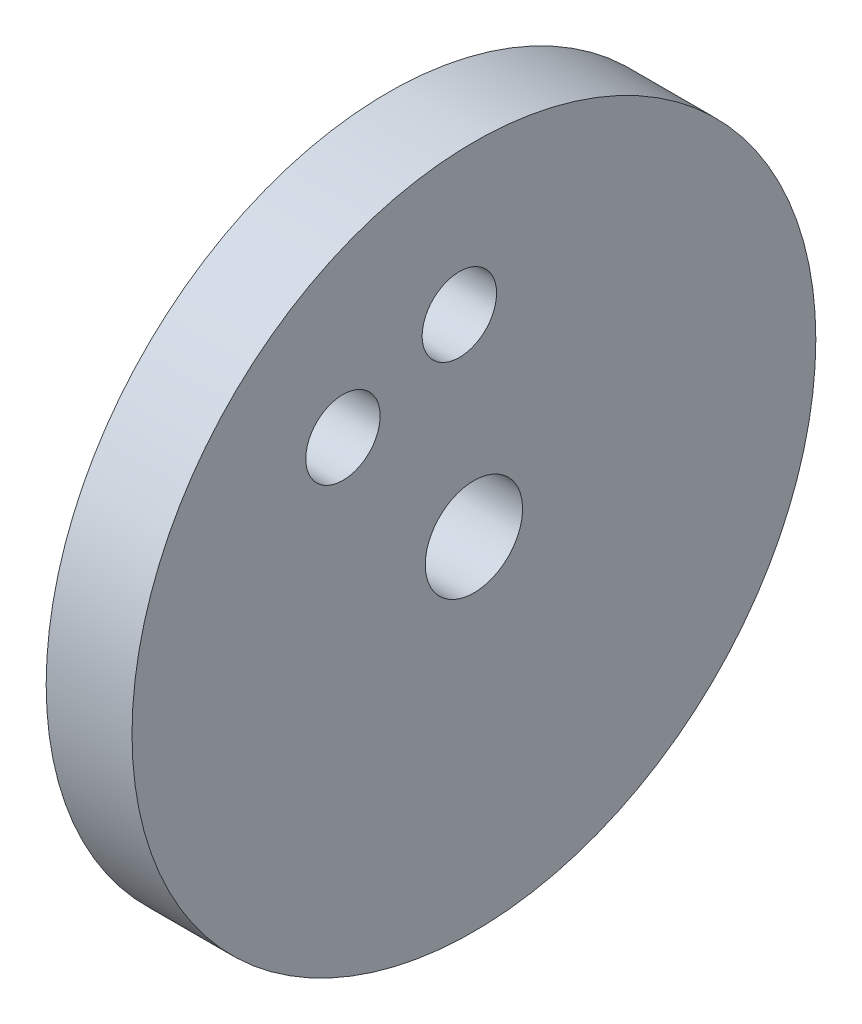
ISO-10303-21;
HEADER;
FILE_DESCRIPTION(('STEP AP214'),'2;1');
FILE_NAME('part.step','',(''),(''),'','','');
FILE_SCHEMA(('AUTOMOTIVE_DESIGN { 1 0 10303 214 1 1 1 1 }'));
ENDSEC;
DATA;
#1=APPLICATION_CONTEXT('core data for automotive mechanical design processes');
#2=APPLICATION_PROTOCOL_DEFINITION('international standard','automotive_design',2000,#1);
#3=PRODUCT_CONTEXT('',#1,'mechanical');
#4=PRODUCT('Part','Part','',(#3));
#5=PRODUCT_RELATED_PRODUCT_CATEGORY('part','',(#4));
#6=PRODUCT_DEFINITION_FORMATION('','',#4);
#7=PRODUCT_DEFINITION_CONTEXT('part definition',#1,'design');
#8=PRODUCT_DEFINITION('design','',#6,#7);
#9=PRODUCT_DEFINITION_SHAPE('','',#8);
#10=(LENGTH_UNIT() NAMED_UNIT(*) SI_UNIT(.MILLI.,.METRE.));
#11=(NAMED_UNIT(*) PLANE_ANGLE_UNIT() SI_UNIT($,.RADIAN.));
#12=(NAMED_UNIT(*) SI_UNIT($,.STERADIAN.) SOLID_ANGLE_UNIT());
#13=UNCERTAINTY_MEASURE_WITH_UNIT(LENGTH_MEASURE(1.E-05),#10,'distance_accuracy_value','');
#14=(GEOMETRIC_REPRESENTATION_CONTEXT(3) GLOBAL_UNCERTAINTY_ASSIGNED_CONTEXT((#13)) GLOBAL_UNIT_ASSIGNED_CONTEXT((#10,
#11,#12)) REPRESENTATION_CONTEXT('',''));
#15=CARTESIAN_POINT('',(0.,0.,0.));
#16=DIRECTION('',(0.,0.,1.));
#17=DIRECTION('',(1.,0.,0.));
#18=AXIS2_PLACEMENT_3D('',#15,#16,#17);
#19=CARTESIAN_POINT('',(73.,23.9,0.));
#20=DIRECTION('',(1.,0.,0.));
#21=DIRECTION('',(0.,0.,-1.));
#22=AXIS2_PLACEMENT_3D('',#19,#20,#21);
#23=PLANE('',#22);
#24=CARTESIAN_POINT('',(73.,13.9630201959503,1.01689085328036));
#25=DIRECTION('',(1.,0.,0.));
#26=DIRECTION('',(0.,0.,-1.));
#27=AXIS2_PLACEMENT_3D('',#24,#25,#26);
#28=CIRCLE('',#27,2.6);
#29=CARTESIAN_POINT('',(73.,13.9630201959503,-1.58310914671964));
#30=VERTEX_POINT('',#29);
#31=EDGE_CURVE('E50',#30,#30,#28,.F.);
#32=ORIENTED_EDGE('',*,*,#31,.F.);
#33=EDGE_LOOP('',(#32));
#34=FACE_BOUND('',#33,.T.);
#35=CARTESIAN_POINT('',(73.,10.5923966844823,9.15429584832002));
#36=DIRECTION('',(1.,0.,0.));
#37=DIRECTION('',(0.,0.,-1.));
#38=AXIS2_PLACEMENT_3D('',#35,#36,#37);
#39=CIRCLE('',#38,2.6);
#40=CARTESIAN_POINT('',(73.,10.5923966844823,6.55429584832002));
#41=VERTEX_POINT('',#40);
#42=EDGE_CURVE('E53',#41,#41,#39,.F.);
#43=ORIENTED_EDGE('',*,*,#42,.F.);
#44=EDGE_LOOP('',(#43));
#45=FACE_BOUND('',#44,.T.);
#46=CARTESIAN_POINT('',(73.,0.,0.));
#47=DIRECTION('',(-1.,0.,0.));
#48=DIRECTION('',(0.,0.,1.));
#49=AXIS2_PLACEMENT_3D('',#46,#47,#48);
#50=CIRCLE('',#49,3.4);
#51=CARTESIAN_POINT('',(73.,0.,3.4));
#52=VERTEX_POINT('',#51);
#53=EDGE_CURVE('E10',#52,#52,#50,.T.);
#54=ORIENTED_EDGE('',*,*,#53,.F.);
#55=EDGE_LOOP('',(#54));
#56=FACE_BOUND('',#55,.T.);
#57=CARTESIAN_POINT('',(73.,0.,0.));
#58=DIRECTION('',(-1.,0.,0.));
#59=DIRECTION('',(0.,0.,1.));
#60=AXIS2_PLACEMENT_3D('',#57,#58,#59);
#61=CIRCLE('',#60,23.9);
#62=CARTESIAN_POINT('',(73.,0.,23.9));
#63=VERTEX_POINT('',#62);
#64=EDGE_CURVE('E45',#63,#63,#61,.T.);
#65=ORIENTED_EDGE('',*,*,#64,.T.);
#66=EDGE_LOOP('',(#65));
#67=FACE_BOUND('',#66,.T.);
#68=ADVANCED_FACE('F31',(#34,#45,#56,#67),#23,.F.);
#69=CARTESIAN_POINT('',(-110.,0.,0.));
#70=DIRECTION('',(-1.,0.,0.));
#71=DIRECTION('',(0.,0.,1.));
#72=AXIS2_PLACEMENT_3D('',#69,#70,#71);
#73=CYLINDRICAL_SURFACE('',#72,3.4);
#74=CARTESIAN_POINT('',(79.,0.,0.));
#75=DIRECTION('',(-1.,0.,0.));
#76=DIRECTION('',(0.,0.,1.));
#77=AXIS2_PLACEMENT_3D('',#74,#75,#76);
#78=CIRCLE('',#77,3.4);
#79=CARTESIAN_POINT('',(79.,0.,3.4));
#80=VERTEX_POINT('',#79);
#81=EDGE_CURVE('E37',#80,#80,#78,.T.);
#82=ORIENTED_EDGE('',*,*,#81,.F.);
#83=EDGE_LOOP('',(#82));
#84=FACE_BOUND('',#83,.T.);
#85=ORIENTED_EDGE('',*,*,#53,.T.);
#86=EDGE_LOOP('',(#85));
#87=FACE_BOUND('',#86,.T.);
#88=ADVANCED_FACE('F70',(#84,#87),#73,.F.);
#89=CARTESIAN_POINT('',(79.,3.4,0.));
#90=DIRECTION('',(-1.,0.,0.));
#91=DIRECTION('',(0.,0.,1.));
#92=AXIS2_PLACEMENT_3D('',#89,#90,#91);
#93=PLANE('',#92);
#94=CARTESIAN_POINT('',(79.,13.9630201959503,1.01689085328036));
#95=DIRECTION('',(1.,0.,0.));
#96=DIRECTION('',(0.,0.,-1.));
#97=AXIS2_PLACEMENT_3D('',#94,#95,#96);
#98=CIRCLE('',#97,2.6);
#99=CARTESIAN_POINT('',(79.,13.9630201959503,-1.58310914671964));
#100=VERTEX_POINT('',#99);
#101=EDGE_CURVE('E56',#100,#100,#98,.T.);
#102=ORIENTED_EDGE('',*,*,#101,.F.);
#103=EDGE_LOOP('',(#102));
#104=FACE_BOUND('',#103,.T.);
#105=CARTESIAN_POINT('',(79.,10.5923966844823,9.15429584832002));
#106=DIRECTION('',(1.,0.,0.));
#107=DIRECTION('',(0.,0.,-1.));
#108=AXIS2_PLACEMENT_3D('',#105,#106,#107);
#109=CIRCLE('',#108,2.6);
#110=CARTESIAN_POINT('',(79.,10.5923966844823,6.55429584832002));
#111=VERTEX_POINT('',#110);
#112=EDGE_CURVE('E57',#111,#111,#109,.T.);
#113=ORIENTED_EDGE('',*,*,#112,.F.);
#114=EDGE_LOOP('',(#113));
#115=FACE_BOUND('',#114,.T.);
#116=CARTESIAN_POINT('',(79.,0.,0.));
#117=DIRECTION('',(-1.,0.,0.));
#118=DIRECTION('',(0.,0.,1.));
#119=AXIS2_PLACEMENT_3D('',#116,#117,#118);
#120=CIRCLE('',#119,23.9);
#121=CARTESIAN_POINT('',(79.,0.,23.9));
#122=VERTEX_POINT('',#121);
#123=EDGE_CURVE('E41',#122,#122,#120,.T.);
#124=ORIENTED_EDGE('',*,*,#123,.F.);
#125=EDGE_LOOP('',(#124));
#126=FACE_BOUND('',#125,.T.);
#127=ORIENTED_EDGE('',*,*,#81,.T.);
#128=EDGE_LOOP('',(#127));
#129=FACE_BOUND('',#128,.T.);
#130=ADVANCED_FACE('F66',(#104,#115,#126,#129),#93,.F.);
#131=CARTESIAN_POINT('',(-110.,0.,0.));
#132=DIRECTION('',(-1.,0.,0.));
#133=DIRECTION('',(0.,0.,1.));
#134=AXIS2_PLACEMENT_3D('',#131,#132,#133);
#135=CYLINDRICAL_SURFACE('',#134,23.9);
#136=ORIENTED_EDGE('',*,*,#64,.F.);
#137=EDGE_LOOP('',(#136));
#138=FACE_BOUND('',#137,.T.);
#139=ORIENTED_EDGE('',*,*,#123,.T.);
#140=EDGE_LOOP('',(#139));
#141=FACE_BOUND('',#140,.T.);
#142=ADVANCED_FACE('F69',(#138,#141),#135,.T.);
#143=CARTESIAN_POINT('',(73.,10.5923966844823,9.15429584832002));
#144=DIRECTION('',(-1.,0.,0.));
#145=DIRECTION('',(0.,0.,1.));
#146=AXIS2_PLACEMENT_3D('',#143,#144,#145);
#147=CYLINDRICAL_SURFACE('',#146,2.6);
#148=ORIENTED_EDGE('',*,*,#112,.T.);
#149=EDGE_LOOP('',(#148));
#150=FACE_BOUND('',#149,.T.);
#151=ORIENTED_EDGE('',*,*,#42,.T.);
#152=EDGE_LOOP('',(#151));
#153=FACE_BOUND('',#152,.T.);
#154=ADVANCED_FACE('F77',(#150,#153),#147,.F.);
#155=CARTESIAN_POINT('',(73.,13.9630201959503,1.01689085328036));
#156=DIRECTION('',(-1.,0.,0.));
#157=DIRECTION('',(0.,0.,1.));
#158=AXIS2_PLACEMENT_3D('',#155,#156,#157);
#159=CYLINDRICAL_SURFACE('',#158,2.6);
#160=ORIENTED_EDGE('',*,*,#101,.T.);
#161=EDGE_LOOP('',(#160));
#162=FACE_BOUND('',#161,.T.);
#163=ORIENTED_EDGE('',*,*,#31,.T.);
#164=EDGE_LOOP('',(#163));
#165=FACE_BOUND('',#164,.T.);
#166=ADVANCED_FACE('F63',(#162,#165),#159,.F.);
#167=CLOSED_SHELL('',(#68,#88,#130,#142,#154,#166));
#168=MANIFOLD_SOLID_BREP('B2',#167);
#169=ADVANCED_BREP_SHAPE_REPRESENTATION('',(#18,#168),#14);
#170=SHAPE_DEFINITION_REPRESENTATION(#9,#169);
ENDSEC;
END-ISO-10303-21;
